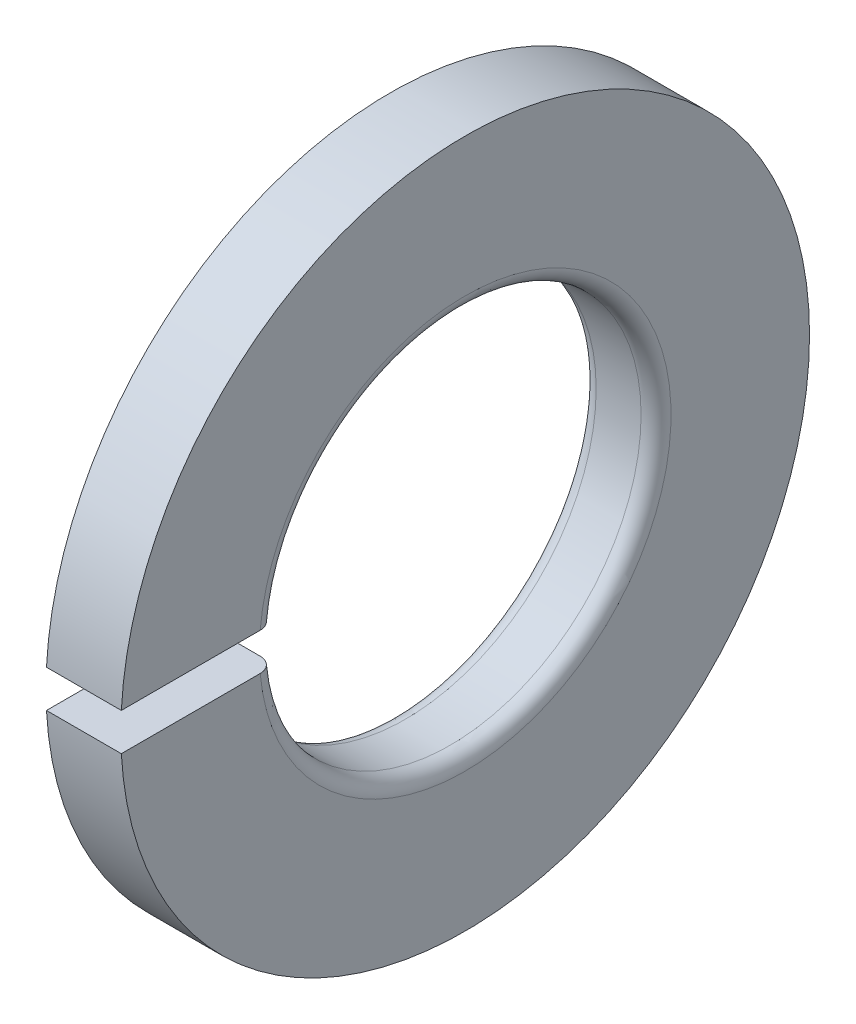
ISO-10303-21;
HEADER;
FILE_DESCRIPTION(('STEP AP214'),'2;1');
FILE_NAME('part.step','',(''),(''),'','','');
FILE_SCHEMA(('AUTOMOTIVE_DESIGN { 1 0 10303 214 1 1 1 1 }'));
ENDSEC;
DATA;
#1=APPLICATION_CONTEXT('core data for automotive mechanical design processes');
#2=APPLICATION_PROTOCOL_DEFINITION('international standard','automotive_design',2000,#1);
#3=PRODUCT_CONTEXT('',#1,'mechanical');
#4=PRODUCT('Part','Part','',(#3));
#5=PRODUCT_RELATED_PRODUCT_CATEGORY('part','',(#4));
#6=PRODUCT_DEFINITION_FORMATION('','',#4);
#7=PRODUCT_DEFINITION_CONTEXT('part definition',#1,'design');
#8=PRODUCT_DEFINITION('design','',#6,#7);
#9=PRODUCT_DEFINITION_SHAPE('','',#8);
#10=(LENGTH_UNIT() NAMED_UNIT(*) SI_UNIT(.MILLI.,.METRE.));
#11=(NAMED_UNIT(*) PLANE_ANGLE_UNIT() SI_UNIT($,.RADIAN.));
#12=(NAMED_UNIT(*) SI_UNIT($,.STERADIAN.) SOLID_ANGLE_UNIT());
#13=UNCERTAINTY_MEASURE_WITH_UNIT(LENGTH_MEASURE(1.E-05),#10,'distance_accuracy_value','');
#14=(GEOMETRIC_REPRESENTATION_CONTEXT(3) GLOBAL_UNCERTAINTY_ASSIGNED_CONTEXT((#13)) GLOBAL_UNIT_ASSIGNED_CONTEXT((#10,
#11,#12)) REPRESENTATION_CONTEXT('',''));
#15=CARTESIAN_POINT('',(0.,0.,0.));
#16=DIRECTION('',(0.,0.,1.));
#17=DIRECTION('',(1.,0.,0.));
#18=AXIS2_PLACEMENT_3D('',#15,#16,#17);
#19=CARTESIAN_POINT('',(-1.,0.25,4.692));
#20=DIRECTION('',(0.,-1.,0.));
#21=DIRECTION('',(0.,0.,-1.));
#22=AXIS2_PLACEMENT_3D('',#19,#20,#21);
#23=PLANE('',#22);
#24=DIRECTION('',(-1.,0.,0.));
#25=VECTOR('',#24,1.);
#26=CARTESIAN_POINT('',(-34.925,0.25,4.59320149786617));
#27=LINE('',#26,#25);
#28=CARTESIAN_POINT('',(0.,0.25,4.59320149786617));
#29=VERTEX_POINT('',#28);
#30=CARTESIAN_POINT('',(-1.,0.25,4.59320149786617));
#31=VERTEX_POINT('',#30);
#32=EDGE_CURVE('E90',#29,#31,#27,.T.);
#33=ORIENTED_EDGE('',*,*,#32,.T.);
#34=DIRECTION('',(0.,0.,-1.));
#35=VECTOR('',#34,1.);
#36=CARTESIAN_POINT('',(-1.,0.25,0.));
#37=LINE('',#36,#35);
#38=CARTESIAN_POINT('',(-1.,0.25,2.73861278752584));
#39=VERTEX_POINT('',#38);
#40=EDGE_CURVE('E25',#31,#39,#37,.T.);
#41=ORIENTED_EDGE('',*,*,#40,.T.);
#42=CARTESIAN_POINT('',(-0.8,0.250000000005694,2.53771550808934));
#43=CARTESIAN_POINT('',(-0.803035810670729,0.249999987980169,2.53771545480922));
#44=CARTESIAN_POINT('',(-0.806071617289434,0.249999353268846,2.53778502517934));
#45=CARTESIAN_POINT('',(-0.812169561448462,0.249997224544185,2.53806448341966));
#46=CARTESIAN_POINT('',(-0.815231630120146,0.24999572134285,2.53827587557851));
#47=CARTESIAN_POINT('',(-0.821375370177262,0.249992240646023,2.53884306055086));
#48=CARTESIAN_POINT('',(-0.824456901392927,0.24999025825402,2.53920037224474));
#49=CARTESIAN_POINT('',(-0.830632451970394,0.249986142296851,2.54006311081197));
#50=CARTESIAN_POINT('',(-0.833726257769468,0.249984007352617,2.54057006675046));
#51=CARTESIAN_POINT('',(-0.839918856411741,0.249979866566684,2.54173550881952));
#52=CARTESIAN_POINT('',(-0.843017360287606,0.249977862316633,2.54239553068693));
#53=CARTESIAN_POINT('',(-0.849211478652672,0.249974210469692,2.54387016019201));
#54=CARTESIAN_POINT('',(-0.852306726952139,0.249972566804721,2.54468630623633));
#55=CARTESIAN_POINT('',(-0.858486093564619,0.24996980900224,2.54647585485791));
#56=CARTESIAN_POINT('',(-0.861569766831158,0.249968700508514,2.54745079439959));
#57=CARTESIAN_POINT('',(-0.867717392994855,0.249967127323592,2.54956018077875));
#58=CARTESIAN_POINT('',(-0.870780820561482,0.249966669341549,2.5506961588209));
#59=CARTESIAN_POINT('',(-0.876879031962958,0.24996644931782,2.55312942023181));
#60=CARTESIAN_POINT('',(-0.879913208977014,0.249966694390875,2.55442822455628));
#61=CARTESIAN_POINT('',(-0.885943682712035,0.24996786814018,2.5571884505233));
#62=CARTESIAN_POINT('',(-0.888939290155829,0.249968803676438,2.55865137821314));
#63=CARTESIAN_POINT('',(-0.894883096912994,0.24997127484204,2.56174064372203));
#64=CARTESIAN_POINT('',(-0.897830523776479,0.249972816372301,2.56336846785874));
#65=CARTESIAN_POINT('',(-0.90366817768213,0.249976355711657,2.56678776820167));
#66=CARTESIAN_POINT('',(-0.906557548677659,0.249978357890109,2.56858070603345));
#67=CARTESIAN_POINT('',(-0.912269055932855,0.249982559741956,2.57232988987556));
#68=CARTESIAN_POINT('',(-0.91509025233708,0.249984761162929,2.5742875676885));
#69=CARTESIAN_POINT('',(-0.920655192954166,0.249989182512798,2.57836528272047));
#70=CARTESIAN_POINT('',(-0.923397913883238,0.249991402412886,2.58048671678096));
#71=CARTESIAN_POINT('',(-0.928795427117442,0.249995013040852,2.58489031594206));
#72=CARTESIAN_POINT('',(-0.931449112331707,0.249996395540874,2.58717383723793));
#73=CARTESIAN_POINT('',(-0.93665827623327,0.249999639817465,2.59189944476943));
#74=CARTESIAN_POINT('',(-0.939212568039209,0.250001506066267,2.59434284242153));
#75=CARTESIAN_POINT('',(-0.942865737354382,0.249999294268007,2.59802761001335));
#76=CARTESIAN_POINT('',(-0.944016716963839,0.249997848045343,2.59921774641522));
#77=CARTESIAN_POINT('',(-0.946436955598768,0.249992015378647,2.60178337342184));
#78=CARTESIAN_POINT('',(-0.947702060456812,0.249987270031931,2.60316279257131));
#79=CARTESIAN_POINT('',(-0.950336883265941,0.249976328201997,2.60611768888772));
#80=CARTESIAN_POINT('',(-0.951701827284564,0.249970027454677,2.60769742206626));
#81=CARTESIAN_POINT('',(-0.954520440133283,0.249956495603357,2.61106430366604));
#82=CARTESIAN_POINT('',(-0.955968677887271,0.249949235688106,2.61285600171163));
#83=CARTESIAN_POINT('',(-0.958935598091309,0.249934652611646,2.61665841612671));
#84=CARTESIAN_POINT('',(-0.960448152929154,0.249927387349311,2.61867391628605));
#85=CARTESIAN_POINT('',(-0.963522883097121,0.249913529254065,2.62293550437869));
#86=CARTESIAN_POINT('',(-0.965078195271772,0.249907047469174,2.62518654719765));
#87=CARTESIAN_POINT('',(-0.96821492990264,0.249895454603422,2.6299303770685));
#88=CARTESIAN_POINT('',(-0.969788715713551,0.24989049218089,2.63242821696515));
#89=CARTESIAN_POINT('',(-0.972936080907932,0.249882511425128,2.63767596624588));
#90=CARTESIAN_POINT('',(-0.974501214454978,0.249879661965969,2.64043094407411));
#91=CARTESIAN_POINT('',(-0.977602073424938,0.249876321101981,2.64620202173346));
#92=CARTESIAN_POINT('',(-0.979128512464887,0.249876003780574,2.6492231155797));
#93=CARTESIAN_POINT('',(-0.982119821171879,0.249877927152562,2.6555335844975));
#94=CARTESIAN_POINT('',(-0.983574535763805,0.249880332477473,2.65882777247265));
#95=CARTESIAN_POINT('',(-0.986387421543504,0.24988763723449,2.66568956550157));
#96=CARTESIAN_POINT('',(-0.987734556350957,0.249892677709196,2.66926171344294));
#97=CARTESIAN_POINT('',(-0.989627808974364,0.249901691559462,2.67474915221755));
#98=CARTESIAN_POINT('',(-0.99024866941524,0.24990502068665,2.67663899777296));
#99=CARTESIAN_POINT('',(-0.991450293532205,0.249912131587267,2.68048789037089));
#100=CARTESIAN_POINT('',(-0.992029509533326,0.249915923201213,2.68244742255276));
#101=CARTESIAN_POINT('',(-0.993142608549284,0.24992384847362,2.68643523544467));
#102=CARTESIAN_POINT('',(-0.993674887139822,0.249927988526809,2.68846396359265));
#103=CARTESIAN_POINT('',(-0.994688765771522,0.249936472335185,2.69258953922476));
#104=CARTESIAN_POINT('',(-0.995168706198018,0.249940818590375,2.69468679481209));
#105=CARTESIAN_POINT('',(-0.996072412565941,0.24994954749752,2.69894847424996));
#106=CARTESIAN_POINT('',(-0.996494464073643,0.249953928320121,2.70111326173971));
#107=CARTESIAN_POINT('',(-0.997276773986528,0.249962528297684,2.70550874460131));
#108=CARTESIAN_POINT('',(-0.997635264152406,0.249966740857766,2.70773975482897));
#109=CARTESIAN_POINT('',(-0.998284720346989,0.249974773915035,2.71226608185326));
#110=CARTESIAN_POINT('',(-0.998573865492926,0.24997858261966,2.71456166005853));
#111=CARTESIAN_POINT('',(-0.999078809068745,0.249985543678804,2.71921516144835));
#112=CARTESIAN_POINT('',(-0.999292735513834,0.24998867861472,2.7215732879133));
#113=CARTESIAN_POINT('',(-0.999641336355726,0.249993992529703,2.72634954184166));
#114=CARTESIAN_POINT('',(-0.999774089267445,0.249996148042166,2.72876780969756));
#115=CARTESIAN_POINT('',(-0.999954416105083,0.249999166715088,2.73366159768258));
#116=CARTESIAN_POINT('',(-1.00000002187016,0.249999999943751,2.73613719048148));
#117=CARTESIAN_POINT('',(-1.,0.25,2.73861278752583));
#118=B_SPLINE_CURVE_WITH_KNOTS('',3,(#42,#43,#44,#45,#46,#47,#48,#49,#50,#51,#52,#53,#54,#55,
#56,#57,#58,#59,#60,#61,#62,#63,#64,#65,#66,#67,#68,#69,#70,#71,#72,#73,#74,#75,#76,#77,#78,#79,
#80,#81,#82,#83,#84,#85,#86,#87,#88,#89,#90,#91,#92,#93,#94,#95,#96,#97,#98,#99,#100,#101,#102,
#103,#104,#105,#106,#107,#108,#109,#110,#111,#112,#113,#114,#115,#116,#117),.UNSPECIFIED.,.F.,
.F.,(4,2,2,2,2,2,2,2,2,2,2,2,2,2,2,2,2,2,2,2,2,2,2,2,2,2,2,2,2,2,2,2,2,2,2,2,2,4),(0.,
0.0091066334769609,0.0183114201061973,0.0276145660572049,0.0370162718552952,0.0465167330499193,
0.0561161408662146,0.0658146828384725,0.0756125434240239,0.0855099045958595,0.0955069464120868,
0.105603847560138,0.115800785873432,0.126097938817996,0.13649548394635,0.146993599315768,
0.15759246386785,0.162559016778658,0.168173381856494,0.174435605098134,0.181345725168376,
0.188903777233304,0.197109795425888,0.205963814531432,0.215465871190603,0.225616004774338,
0.236414258008793,0.247860677385231,0.253827618592855,0.259956675222,0.266247857164978,
0.272701174626643,0.279316638110895,0.286094258402887,0.293034046546651,0.300136013817895,
0.307400171691676,0.314826531804691),.UNSPECIFIED.);
#119=CARTESIAN_POINT('',(-0.799999999990839,0.25,2.53771550803154));
#120=VERTEX_POINT('',#119);
#121=EDGE_CURVE('E160',#120,#39,#118,.T.);
#122=ORIENTED_EDGE('',*,*,#121,.F.);
#123=DIRECTION('',(1.,0.,0.));
#124=VECTOR('',#123,1.);
#125=CARTESIAN_POINT('',(-34.925,0.25,2.53771550808991));
#126=LINE('',#125,#124);
#127=CARTESIAN_POINT('',(-0.2,0.25,2.53771550808991));
#128=VERTEX_POINT('',#127);
#129=EDGE_CURVE('E164',#120,#128,#126,.T.);
#130=ORIENTED_EDGE('',*,*,#129,.T.);
#131=CARTESIAN_POINT('',(0.,0.25,2.73861278752583));
#132=CARTESIAN_POINT('',(2.18630139981742E-08,0.249999999943789,2.73613739701448));
#133=CARTESIAN_POINT('',(-4.55762893479276E-05,0.24999916671474,2.73366201074611));
#134=CARTESIAN_POINT('',(-0.000225873773357249,0.249996147951057,2.72876861076899));
#135=CARTESIAN_POINT('',(-0.000358605982107729,0.249993992339121,2.72635052443488));
#136=CARTESIAN_POINT('',(-0.000707154429438264,0.24998867804353,2.72157460794371));
#137=CARTESIAN_POINT('',(-0.000921050179730413,0.249985542821434,2.7192166374782));
#138=CARTESIAN_POINT('',(-0.00142592442332328,0.249978580939847,2.71456342216856));
#139=CARTESIAN_POINT('',(-0.00171503188571923,0.249974771697552,2.71226797416306));
#140=CARTESIAN_POINT('',(-0.00236440769589465,0.249966737267937,2.70774188152525));
#141=CARTESIAN_POINT('',(-0.00272285607107772,0.249962523874993,2.70551097563379));
#142=CARTESIAN_POINT('',(-0.00350508018199406,0.249953921907547,2.70111567553281));
#143=CARTESIAN_POINT('',(-0.00392708854420214,0.249949539932554,2.69895096664308));
#144=CARTESIAN_POINT('',(-0.00483070905884299,0.249940808387292,2.69468941876843));
#145=CARTESIAN_POINT('',(-0.00531060759859625,0.249936460653408,2.69259221634177));
#146=CARTESIAN_POINT('',(-0.00632440540788457,0.249927973561392,2.6884667218211));
#147=CARTESIAN_POINT('',(-0.00685664583891303,0.24992383171228,2.68643802183925));
#148=CARTESIAN_POINT('',(-0.00796967384973133,0.249915902543141,2.68245024062773));
#149=CARTESIAN_POINT('',(-0.00854885773674891,0.249912108839002,2.68049071218918));
#150=CARTESIAN_POINT('',(-0.00975042514975218,0.249904993487638,2.67664180309654));
#151=CARTESIAN_POINT('',(-0.0103712616874673,0.249901662011683,2.67475193754321));
#152=CARTESIAN_POINT('',(-0.0122644699242043,0.249892640819421,2.66926436999144));
#153=CARTESIAN_POINT('',(-0.0136115894664298,0.249887595042854,2.66569211383123));
#154=CARTESIAN_POINT('',(-0.0164244952831761,0.249880279185803,2.65883001732693));
#155=CARTESIAN_POINT('',(-0.0178792496325221,0.249877868166916,2.65553563609904));
#156=CARTESIAN_POINT('',(-0.020870700906079,0.249875933476025,2.64922470116607));
#157=CARTESIAN_POINT('',(-0.0223972465542912,0.249876245267126,2.6462033364856));
#158=CARTESIAN_POINT('',(-0.0254983919397497,0.249879575760511,2.64043164537649));
#159=CARTESIAN_POINT('',(-0.0270637084673507,0.249882420451496,2.63767632671061));
#160=CARTESIAN_POINT('',(-0.0302115207831002,0.249890393000787,2.63242783145036));
#161=CARTESIAN_POINT('',(-0.0317855733193617,0.249895352020401,2.62992958796494));
#162=CARTESIAN_POINT('',(-0.0349229285126084,0.249906940018394,2.62518489349163));
#163=CARTESIAN_POINT('',(-0.0364785965569638,0.24991342032215,2.62293339092663));
#164=CARTESIAN_POINT('',(-0.0395541297062014,0.249927277991779,2.61867083189355));
#165=CARTESIAN_POINT('',(-0.041067133172976,0.249934544218703,2.6166548214713));
#166=CARTESIAN_POINT('',(-0.0440350443824434,0.249949132164708,2.61285133992501));
#167=CARTESIAN_POINT('',(-0.0454838255487885,0.249956395805724,2.61105908556477));
#168=CARTESIAN_POINT('',(-0.0483036200083203,0.249969938768157,2.60769104822344));
#169=CARTESIAN_POINT('',(-0.0496692028122824,0.249976246552687,2.60611071576471));
#170=CARTESIAN_POINT('',(-0.0523053977858411,0.249987205511879,2.60315457985704));
#171=CARTESIAN_POINT('',(-0.0535712361826897,0.24999196052777,2.60177452010478));
#172=CARTESIAN_POINT('',(-0.0559930349613682,0.2499978186797,2.59920757119292));
#173=CARTESIAN_POINT('',(-0.0571448409500505,0.249999279595896,2.59801675277638));
#174=CARTESIAN_POINT('',(-0.0607984174761133,0.250001535995203,2.59433216638235));
#175=CARTESIAN_POINT('',(-0.0633522325210134,0.249999705638478,2.59188958391966));
#176=CARTESIAN_POINT('',(-0.0685604245889835,0.249996520807756,2.58716549180807));
#177=CARTESIAN_POINT('',(-0.0712136177826744,0.249995161983957,2.58488267394276));
#178=CARTESIAN_POINT('',(-0.0766101419244031,0.249991593131311,2.58048037144688));
#179=CARTESIAN_POINT('',(-0.0793523686080947,0.249989391364562,2.57835953393239));
#180=CARTESIAN_POINT('',(-0.0849163286929747,0.249984999438434,2.57428290767685));
#181=CARTESIAN_POINT('',(-0.0877370413985438,0.249982809371634,2.57232572550125));
#182=CARTESIAN_POINT('',(-0.0934476010108547,0.249978624373543,2.5685774355022));
#183=CARTESIAN_POINT('',(-0.0963365104170268,0.249976627753656,2.56678489936016));
#184=CARTESIAN_POINT('',(-0.10217327166956,0.249973094210416,2.56336631272516));
#185=CARTESIAN_POINT('',(-0.105120269592651,0.249971552978027,2.56173880415095));
#186=CARTESIAN_POINT('',(-0.111063258645877,0.249969077859808,2.55865008860764));
#187=CARTESIAN_POINT('',(-0.114058479222035,0.249968138130129,2.55718739890921));
#188=CARTESIAN_POINT('',(-0.120088227923821,0.249966952259826,2.55442757690813));
#189=CARTESIAN_POINT('',(-0.123122068445446,0.249966699311301,2.55312894217513));
#190=CARTESIAN_POINT('',(-0.129219662948015,0.24996690074148,2.55069595758472));
#191=CARTESIAN_POINT('',(-0.132282811564275,0.249967348050167,2.54956009040257));
#192=CARTESIAN_POINT('',(-0.138429942156175,0.249968897989504,2.54745087343286));
#193=CARTESIAN_POINT('',(-0.141513400046784,0.249969993946169,2.54647599607195));
#194=CARTESIAN_POINT('',(-0.147692403346863,0.249972725762577,2.54468652984083));
#195=CARTESIAN_POINT('',(-0.15078750475191,0.249974356001969,2.54387040762508));
#196=CARTESIAN_POINT('',(-0.156981400763264,0.249977981103339,2.54239579432859));
#197=CARTESIAN_POINT('',(-0.160079830026201,0.249979972042991,2.54173576843576));
#198=CARTESIAN_POINT('',(-0.166272353783865,0.249984087349718,2.5405702974742));
#199=CARTESIAN_POINT('',(-0.169366159970223,0.249986210118863,2.54006332022797));
#200=CARTESIAN_POINT('',(-0.175541787513029,0.249990303913966,2.53920052880077));
#201=CARTESIAN_POINT('',(-0.178623395787023,0.249992276294791,2.53884318906861));
#202=CARTESIAN_POINT('',(-0.184767366981952,0.24999574019279,2.53827594828228));
#203=CARTESIAN_POINT('',(-0.187829590043833,0.24999723656265,2.53806453180766));
#204=CARTESIAN_POINT('',(-0.193927919865005,0.249999355902649,2.53778503550966));
#205=CARTESIAN_POINT('',(-0.196963957905985,0.249999987994693,2.53771545479351));
#206=CARTESIAN_POINT('',(-0.2,0.25,2.5377155080899));
#207=B_SPLINE_CURVE_WITH_KNOTS('',3,(#131,#132,#133,#134,#135,#136,#137,#138,#139,#140,#141,
#142,#143,#144,#145,#146,#147,#148,#149,#150,#151,#152,#153,#154,#155,#156,#157,#158,#159,#160,
#161,#162,#163,#164,#165,#166,#167,#168,#169,#170,#171,#172,#173,#174,#175,#176,#177,#178,#179,
#180,#181,#182,#183,#184,#185,#186,#187,#188,#189,#190,#191,#192,#193,#194,#195,#196,#197,#198,
#199,#200,#201,#202,#203,#204,#205,#206),.UNSPECIFIED.,.F.,.F.,(4,2,2,2,2,2,2,2,2,2,2,2,2,2,2,2,
2,2,2,2,2,2,2,2,2,2,2,2,2,2,2,2,2,2,2,2,2,4),(0.,0.0074257406256499,0.0146893517035632,
0.0217908448666269,0.0287302315862876,0.0355075231348463,0.0421227305531616,0.0485758646234472,
0.0548669358469176,0.0609959544259886,0.0669629302507866,0.0784096367681095,0.0892084677236841,
0.0993594696175504,0.108862685186243,0.11771815381215,0.125925912147751,0.133485994989542,
0.140398436479562,0.146663271788391,0.152280539576362,0.157250285818283,0.167846430876044,
0.178342054113755,0.188737334533879,0.199032450249775,0.209227578864632,0.219322897889018,
0.229318585193989,0.239214819496867,0.249011780876988,0.258709651318936,0.268308615280953,
0.277808860286439,0.287210577536652,0.296513962542896,0.305719215776723,0.314826543336796),.UNSPECIFIED.);
#208=CARTESIAN_POINT('',(0.,0.25,2.73861278752583));
#209=VERTEX_POINT('',#208);
#210=EDGE_CURVE('E92',#209,#128,#207,.T.);
#211=ORIENTED_EDGE('',*,*,#210,.F.);
#212=DIRECTION('',(0.,0.,-1.));
#213=VECTOR('',#212,1.);
#214=CARTESIAN_POINT('',(0.,0.25,4.692));
#215=LINE('',#214,#213);
#216=EDGE_CURVE('E87',#29,#209,#215,.T.);
#217=ORIENTED_EDGE('',*,*,#216,.F.);
#218=EDGE_LOOP('',(#33,#41,#122,#130,#211,#217));
#219=FACE_BOUND('',#218,.T.);
#220=ADVANCED_FACE('F15',(#219),#23,.T.);
#221=CARTESIAN_POINT('',(-1.,-0.25,0.));
#222=DIRECTION('',(0.,1.,0.));
#223=DIRECTION('',(1.,0.,0.));
#224=AXIS2_PLACEMENT_3D('',#221,#222,#223);
#225=PLANE('',#224);
#226=DIRECTION('',(1.,0.,0.));
#227=VECTOR('',#226,1.);
#228=CARTESIAN_POINT('',(-34.925,-0.25,4.59320149786617));
#229=LINE('',#228,#227);
#230=CARTESIAN_POINT('',(-1.,-0.25,4.59320149786617));
#231=VERTEX_POINT('',#230);
#232=CARTESIAN_POINT('',(0.,-0.25,4.59320149786617));
#233=VERTEX_POINT('',#232);
#234=EDGE_CURVE('E109',#231,#233,#229,.T.);
#235=ORIENTED_EDGE('',*,*,#234,.T.);
#236=DIRECTION('',(0.,0.,1.));
#237=VECTOR('',#236,1.);
#238=CARTESIAN_POINT('',(0.,-0.25,0.));
#239=LINE('',#238,#237);
#240=CARTESIAN_POINT('',(0.,-0.25,2.73861278752583));
#241=VERTEX_POINT('',#240);
#242=EDGE_CURVE('E104',#241,#233,#239,.T.);
#243=ORIENTED_EDGE('',*,*,#242,.F.);
#244=CARTESIAN_POINT('',(-0.2,-0.249999999999992,2.5377155080899));
#245=CARTESIAN_POINT('',(-0.196964189324893,-0.249999987974466,2.53771545480978));
#246=CARTESIAN_POINT('',(-0.193928382701809,-0.24999935326317,2.5377850251801));
#247=CARTESIAN_POINT('',(-0.187830438534622,-0.249997224538614,2.53806448342118));
#248=CARTESIAN_POINT('',(-0.184768369859155,-0.249995721337355,2.53827587558058));
#249=CARTESIAN_POINT('',(-0.178624629795092,-0.249992240640719,2.53884306055432));
#250=CARTESIAN_POINT('',(-0.175543098576261,-0.249990258248832,2.53920037224901));
#251=CARTESIAN_POINT('',(-0.169367547993091,-0.249986142291928,2.5400631108181));
#252=CARTESIAN_POINT('',(-0.166273742191478,-0.249984007347846,2.5405700667576));
#253=CARTESIAN_POINT('',(-0.160081143544766,-0.249979866562237,2.54173550882883));
#254=CARTESIAN_POINT('',(-0.156982639666997,-0.249977862312358,2.54239553069736));
#255=CARTESIAN_POINT('',(-0.150788521298759,-0.249974210465781,2.54387016020475));
#256=CARTESIAN_POINT('',(-0.14769327299802,-0.249972566801004,2.54468630625024));
#257=CARTESIAN_POINT('',(-0.141513906383625,-0.249969808998914,2.54647585487413));
#258=CARTESIAN_POINT('',(-0.138430233116437,-0.249968700505386,2.54745079441691));
#259=CARTESIAN_POINT('',(-0.132282606952056,-0.249967127320866,2.54956018079821));
#260=CARTESIAN_POINT('',(-0.129219179385385,-0.249966669339025,2.55069615884133));
#261=CARTESIAN_POINT('',(-0.123120967984412,-0.249966449315691,2.55312942025404));
#262=CARTESIAN_POINT('',(-0.120086790970892,-0.24996669438894,2.55442822457929));
#263=CARTESIAN_POINT('',(-0.114056317237501,-0.249967868138619,2.55718845054759));
#264=CARTESIAN_POINT('',(-0.111060709794788,-0.249968803675057,2.55865137823792));
#265=CARTESIAN_POINT('',(-0.105116903040304,-0.249971274840999,2.56174064374744));
#266=CARTESIAN_POINT('',(-0.102169476178404,-0.24997281637142,2.56336846788427));
#267=CARTESIAN_POINT('',(-0.0963318222763901,-0.249976355711063,2.56678776822702));
#268=CARTESIAN_POINT('',(-0.0934424512828973,-0.249978357889643,2.56858070605848));
#269=CARTESIAN_POINT('',(-0.0877309440321833,-0.249982559741716,2.57232988989945));
#270=CARTESIAN_POINT('',(-0.0849097476303873,-0.249984761162786,2.57428756771156));
#271=CARTESIAN_POINT('',(-0.0793448070185001,-0.249989182512804,2.5783652827413));
#272=CARTESIAN_POINT('',(-0.0766020860921807,-0.249991402412944,2.58048671680038));
#273=CARTESIAN_POINT('',(-0.0712045728637473,-0.249995013040974,2.58489031595803));
#274=CARTESIAN_POINT('',(-0.0685508876524812,-0.24999639554101,2.58717383725185));
#275=CARTESIAN_POINT('',(-0.0633417237571016,-0.24999963981756,2.59189944477857));
#276=CARTESIAN_POINT('',(-0.0607874319543256,-0.250001506066305,2.59434284242792));
#277=CARTESIAN_POINT('',(-0.057134262641161,-0.249999294267968,2.59802761001791));
#278=CARTESIAN_POINT('',(-0.055983283030733,-0.249997848045275,2.59921774642087));
#279=CARTESIAN_POINT('',(-0.0535630443940644,-0.249992015378536,2.60178337342958));
#280=CARTESIAN_POINT('',(-0.0522979395352509,-0.249987270031805,2.60316279258004));
#281=CARTESIAN_POINT('',(-0.0496631167247878,-0.249976328201846,2.60611768889833));
#282=CARTESIAN_POINT('',(-0.0482981727055976,-0.249970027454516,2.60769742207776));
#283=CARTESIAN_POINT('',(-0.0454795598559445,-0.249956495603183,2.61106430367921));
#284=CARTESIAN_POINT('',(-0.0440313221015863,-0.249949235687929,2.61285600172557));
#285=CARTESIAN_POINT('',(-0.0410644018970027,-0.249934652611471,2.61665841614208));
#286=CARTESIAN_POINT('',(-0.0395518470589777,-0.249927387349141,2.61867391630207));
#287=CARTESIAN_POINT('',(-0.0364771168908344,-0.249913529253905,2.62293550439588));
#288=CARTESIAN_POINT('',(-0.0349218047161818,-0.24990704746902,2.62518654721534));
#289=CARTESIAN_POINT('',(-0.0317850700854806,-0.249895454603284,2.62993037708706));
#290=CARTESIAN_POINT('',(-0.030211284274732,-0.249890492180761,2.63242821698406));
#291=CARTESIAN_POINT('',(-0.0270639190808263,-0.24988251142502,2.63767596626532));
#292=CARTESIAN_POINT('',(-0.0254987855340859,-0.249879661965872,2.64043094409373));
#293=CARTESIAN_POINT('',(-0.0223979265648659,-0.249876321101906,2.64620202175324));
#294=CARTESIAN_POINT('',(-0.0208714875253425,-0.249876003780509,2.64922311559946));
#295=CARTESIAN_POINT('',(-0.0178801788192994,-0.249877927152519,2.65553358451702));
#296=CARTESIAN_POINT('',(-0.0164254642278877,-0.249880332477442,2.65882777249195));
#297=CARTESIAN_POINT('',(-0.013612578449283,-0.249887637234477,2.66568956552019));
#298=CARTESIAN_POINT('',(-0.0122654436423985,-0.249892677709188,2.66926171346111));
#299=CARTESIAN_POINT('',(-0.0103721910198325,-0.249901691559465,2.67474915223494));
#300=CARTESIAN_POINT('',(-0.0097513305792477,-0.249905020686658,2.67663899779004));
#301=CARTESIAN_POINT('',(-0.00854970646286538,-0.249912131587279,2.68048789038728));
#302=CARTESIAN_POINT('',(-0.0079704904620339,-0.249915923201224,2.68244742256877));
#303=CARTESIAN_POINT('',(-0.00685739144664883,-0.249923848473633,2.68643523545988));
#304=CARTESIAN_POINT('',(-0.006325112856392,-0.249927988526823,2.68846396360742));
#305=CARTESIAN_POINT('',(-0.00531123422524181,-0.249936472335202,2.69258953923859));
#306=CARTESIAN_POINT('',(-0.00483129379901255,-0.249940818590393,2.69468679482542));
#307=CARTESIAN_POINT('',(-0.00392758743160403,-0.249949547497537,2.69894847426223));
#308=CARTESIAN_POINT('',(-0.00350553592414775,-0.249953928320137,2.70111326175142));
#309=CARTESIAN_POINT('',(-0.00272322601172843,-0.249962528297701,2.70550874461183));
#310=CARTESIAN_POINT('',(-0.00236473584606731,-0.249966740857785,2.70773975483887));
#311=CARTESIAN_POINT('',(-0.00171527965188707,-0.249974773915051,2.71226608186185));
#312=CARTESIAN_POINT('',(-0.00142613450613195,-0.249978582619671,2.71456166006643));
#313=CARTESIAN_POINT('',(-0.000921190930638207,-0.249985543678813,2.71921516145483));
#314=CARTESIAN_POINT('',(-0.00070726448568893,-0.249988678614729,2.72157328791903));
#315=CARTESIAN_POINT('',(-0.000358663644029337,-0.249993992529712,2.72634954184584));
#316=CARTESIAN_POINT('',(-0.000225910732399715,-0.249996148042173,2.72876780970094));
#317=CARTESIAN_POINT('',(-4.55838948854964E-05,-0.249999166715091,2.7336615976843));
#318=CARTESIAN_POINT('',(2.18701560313154E-08,-0.249999999943752,2.73613719048233));
#319=CARTESIAN_POINT('',(0.,-0.250000000000004,2.73861278752583));
#320=B_SPLINE_CURVE_WITH_KNOTS('',3,(#244,#245,#246,#247,#248,#249,#250,#251,#252,#253,#254,
#255,#256,#257,#258,#259,#260,#261,#262,#263,#264,#265,#266,#267,#268,#269,#270,#271,#272,#273,
#274,#275,#276,#277,#278,#279,#280,#281,#282,#283,#284,#285,#286,#287,#288,#289,#290,#291,#292,
#293,#294,#295,#296,#297,#298,#299,#300,#301,#302,#303,#304,#305,#306,#307,#308,#309,#310,#311,
#312,#313,#314,#315,#316,#317,#318,#319),.UNSPECIFIED.,.F.,.F.,(4,2,2,2,2,2,2,2,2,2,2,2,2,2,2,2,
2,2,2,2,2,2,2,2,2,2,2,2,2,2,2,2,2,2,2,2,2,4),(0.,0.00910663349009214,0.0183114201307491,
0.027614566091466,0.0370162718975539,0.0465167330984638,0.0561161409193331,0.0658146828944527,
0.075612543481154,0.0855099046524277,0.0955069464663812,0.105603847610448,0.115800785918047,
0.126097938855204,0.136495483974442,0.146993599333034,0.157592463872583,0.16255901678777,
0.168173381869359,0.174435605114128,0.181345725186875,0.188903777253683,0.197109795447522,
0.205963814553697,0.215465871212874,0.22561600479599,0.236414258029201,0.247860677403771,
0.253827618610226,0.259956675238046,0.266247857179542,0.272701174639569,0.279316638122028,
0.28609425841207,0.293034046553728,0.300136013822707,0.307400171694069,0.314826531804509),.UNSPECIFIED.);
#321=CARTESIAN_POINT('',(-0.2,-0.25,2.53771550808991));
#322=VERTEX_POINT('',#321);
#323=EDGE_CURVE('E173',#322,#241,#320,.T.);
#324=ORIENTED_EDGE('',*,*,#323,.F.);
#325=DIRECTION('',(-1.,0.,0.));
#326=VECTOR('',#325,1.);
#327=CARTESIAN_POINT('',(-34.925,-0.25,2.53771550808991));
#328=LINE('',#327,#326);
#329=CARTESIAN_POINT('',(-0.8,-0.25,2.53771550808991));
#330=VERTEX_POINT('',#329);
#331=EDGE_CURVE('E257',#322,#330,#328,.T.);
#332=ORIENTED_EDGE('',*,*,#331,.T.);
#333=CARTESIAN_POINT('',(-1.,-0.250000000000004,2.73861278752583));
#334=CARTESIAN_POINT('',(-1.00000002186301,-0.249999999943793,2.73613739701654));
#335=CARTESIAN_POINT('',(-0.999954423710728,-0.249999166714746,2.73366201075023));
#336=CARTESIAN_POINT('',(-0.999774126227016,-0.249996147951067,2.72876861077708));
#337=CARTESIAN_POINT('',(-0.999641394018479,-0.249993992339134,2.7263505244449));
#338=CARTESIAN_POINT('',(-0.999292845571703,-0.249988678043546,2.72157460795742));
#339=CARTESIAN_POINT('',(-0.999078949821744,-0.249985542821449,2.71921663749367));
#340=CARTESIAN_POINT('',(-0.998574075578924,-0.249978580939867,2.71456342218742));
#341=CARTESIAN_POINT('',(-0.998284968116961,-0.249974771697576,2.71226797418355));
#342=CARTESIAN_POINT('',(-0.997635592307739,-0.249966737267965,2.70774188154882));
#343=CARTESIAN_POINT('',(-0.997277143933071,-0.249962523875024,2.70551097565883));
#344=CARTESIAN_POINT('',(-0.996494919823253,-0.249953921907578,2.70111567556061));
#345=CARTESIAN_POINT('',(-0.996072911461624,-0.249949539932583,2.69895096667219));
#346=CARTESIAN_POINT('',(-0.995169290948191,-0.249940808387318,2.6946894188));
#347=CARTESIAN_POINT('',(-0.994689392409062,-0.249936460653432,2.6925922163745));
#348=CARTESIAN_POINT('',(-0.993675594601058,-0.24992797356141,2.68846672185597));
#349=CARTESIAN_POINT('',(-0.993143354170684,-0.249923831712295,2.68643802187512));
#350=CARTESIAN_POINT('',(-0.992030326161194,-0.249915902543147,2.68245024066543));
#351=CARTESIAN_POINT('',(-0.991451142274845,-0.249912108839003,2.68049071222773));
#352=CARTESIAN_POINT('',(-0.990249574863183,-0.249904993487627,2.67664180313661));
#353=CARTESIAN_POINT('',(-0.989628738326136,-0.249901662011665,2.67475193758398));
#354=CARTESIAN_POINT('',(-0.987735530091307,-0.249892640819379,2.66926437003386));
#355=CARTESIAN_POINT('',(-0.986388410550363,-0.249887595042792,2.6656921138746));
#356=CARTESIAN_POINT('',(-0.98357550473605,-0.249880279185694,2.65883001737159));
#357=CARTESIAN_POINT('',(-0.982120750387827,-0.249877868166779,2.65553563614408));
#358=CARTESIAN_POINT('',(-0.979129299116296,-0.249875933475834,2.64922470121133));
#359=CARTESIAN_POINT('',(-0.977602753468962,-0.249876245266909,2.64620333653071));
#360=CARTESIAN_POINT('',(-0.974501608084963,-0.249879575760238,2.64043164542081));
#361=CARTESIAN_POINT('',(-0.972936291557922,-0.249882420451195,2.63767632675431));
#362=CARTESIAN_POINT('',(-0.969788479242933,-0.249890393000435,2.63242783149236));
#363=CARTESIAN_POINT('',(-0.968214426706854,-0.249895352020026,2.62992958800589));
#364=CARTESIAN_POINT('',(-0.96507707151356,-0.249906940017982,2.62518489353006));
#365=CARTESIAN_POINT('',(-0.963521403468961,-0.249913420321722,2.62293339096361));
#366=CARTESIAN_POINT('',(-0.960445870318786,-0.24992727799133,2.61867083192727));
#367=CARTESIAN_POINT('',(-0.958932866851306,-0.249934544218248,2.61665482150323));
#368=CARTESIAN_POINT('',(-0.955964955639947,-0.249949132164256,2.61285133995302));
#369=CARTESIAN_POINT('',(-0.954516174472407,-0.24995639580528,2.61105908559067));
#370=CARTESIAN_POINT('',(-0.951696380009986,-0.249969938767751,2.60769104824484));
#371=CARTESIAN_POINT('',(-0.950330797204324,-0.249976246552309,2.60611071578371));
#372=CARTESIAN_POINT('',(-0.947694602226854,-0.249987205511572,2.60315457987099));
#373=CARTESIAN_POINT('',(-0.94642876382779,-0.249991960527504,2.60177452011608));
#374=CARTESIAN_POINT('',(-0.944006965044166,-0.249997818679551,2.59920757119865));
#375=CARTESIAN_POINT('',(-0.942855159052752,-0.249999279595818,2.59801675277921));
#376=CARTESIAN_POINT('',(-0.939201582525618,-0.250001535995348,2.59433216638408));
#377=CARTESIAN_POINT('',(-0.936647767482543,-0.249999705638803,2.59188958392303));
#378=CARTESIAN_POINT('',(-0.931439575418145,-0.249996520808373,2.5871654918143));
#379=CARTESIAN_POINT('',(-0.92878638222619,-0.249995161984685,2.58488267395023));
#380=CARTESIAN_POINT('',(-0.92338985808781,-0.249991593132237,2.58048037145645));
#381=CARTESIAN_POINT('',(-0.920647631405719,-0.249989391365576,2.57835953394283));
#382=CARTESIAN_POINT('',(-0.91508367132387,-0.249984999439586,2.57428290768867));
#383=CARTESIAN_POINT('',(-0.912262958619721,-0.249982809372836,2.5723257255136));
#384=CARTESIAN_POINT('',(-0.90655239901004,-0.24997862437482,2.56857743551531));
#385=CARTESIAN_POINT('',(-0.903663489605068,-0.249976627754957,2.56678489937351));
#386=CARTESIAN_POINT('',(-0.89782672835469,-0.249973094211739,2.5633663127387));
#387=CARTESIAN_POINT('',(-0.894879730432544,-0.249971552979349,2.56173880416448));
#388=CARTESIAN_POINT('',(-0.888936741380933,-0.249969077861105,2.55865008862089));
#389=CARTESIAN_POINT('',(-0.885941520805437,-0.249968138131403,2.55718739892222));
#390=CARTESIAN_POINT('',(-0.87991177210467,-0.249966952261035,2.55442757692049));
#391=CARTESIAN_POINT('',(-0.876877931583398,-0.249966699312471,2.55312894218708));
#392=CARTESIAN_POINT('',(-0.870780337081209,-0.249966900742557,2.55069595759572));
#393=CARTESIAN_POINT('',(-0.867717188464971,-0.249967348051191,2.54956009041304));
#394=CARTESIAN_POINT('',(-0.861570057872777,-0.249968897990415,2.54745087344218));
#395=CARTESIAN_POINT('',(-0.858486599981845,-0.24996999394702,2.54647599608065));
#396=CARTESIAN_POINT('',(-0.852307596680771,-0.249972725763303,2.54468652984827));
#397=CARTESIAN_POINT('',(-0.849212495275047,-0.249974356002631,2.54387040763187));
#398=CARTESIAN_POINT('',(-0.843018599261981,-0.249977981103877,2.5423957943341));
#399=CARTESIAN_POINT('',(-0.839920169998005,-0.249979972043469,2.54173576844065));
#400=CARTESIAN_POINT('',(-0.833727646237906,-0.249984087350076,2.54057029747789));
#401=CARTESIAN_POINT('',(-0.830633840050148,-0.249986210119163,2.54006332023109));
#402=CARTESIAN_POINT('',(-0.824458212504184,-0.249990303914164,2.53920052880285));
#403=CARTESIAN_POINT('',(-0.82137660422843,-0.249992276294945,2.53884318907024));
#404=CARTESIAN_POINT('',(-0.815232633029631,-0.249995740192868,2.53827594828313));
#405=CARTESIAN_POINT('',(-0.812170409965638,-0.249997236562695,2.5380645318082));
#406=CARTESIAN_POINT('',(-0.806072080139902,-0.24999935590265,2.53778503550978));
#407=CARTESIAN_POINT('',(-0.803036042096468,-0.249999987994682,2.53771545479351));
#408=CARTESIAN_POINT('',(-0.8,-0.249999999999992,2.5377155080899));
#409=B_SPLINE_CURVE_WITH_KNOTS('',3,(#333,#334,#335,#336,#337,#338,#339,#340,#341,#342,#343,
#344,#345,#346,#347,#348,#349,#350,#351,#352,#353,#354,#355,#356,#357,#358,#359,#360,#361,#362,
#363,#364,#365,#366,#367,#368,#369,#370,#371,#372,#373,#374,#375,#376,#377,#378,#379,#380,#381,
#382,#383,#384,#385,#386,#387,#388,#389,#390,#391,#392,#393,#394,#395,#396,#397,#398,#399,#400,
#401,#402,#403,#404,#405,#406,#407,#408),.UNSPECIFIED.,.F.,.F.,(4,2,2,2,2,2,2,2,2,2,2,2,2,2,2,2,
2,2,2,2,2,2,2,2,2,2,2,2,2,2,2,2,2,2,2,2,2,4),(0.,0.00742574061947288,0.0146893516916072,
0.021790844849292,0.0287302315639711,0.0355075231079477,0.0421227305220785,0.0485758645885795,
0.0548669358086632,0.060995954384746,0.0669629302069547,0.0784096367202954,0.0892084676734808,
0.0993594695665518,0.108862685136042,0.117718153764339,0.125925912103925,0.133485994951294,
0.140398436448485,0.146663271766079,0.152280539564407,0.157250285818279,0.167846430868698,
0.178342054100045,0.188737334514783,0.199032450226272,0.2092275788377,0.219322897859636,
0.229318585163137,0.239214819465524,0.249011780846136,0.258709651289555,0.268308615254024,
0.277808860262943,0.28721057751757,0.29651396252921,0.305719215769413,0.314826543336845),.UNSPECIFIED.);
#410=CARTESIAN_POINT('',(-1.,-0.25,2.73861278752584));
#411=VERTEX_POINT('',#410);
#412=EDGE_CURVE('E127',#411,#330,#409,.T.);
#413=ORIENTED_EDGE('',*,*,#412,.F.);
#414=DIRECTION('',(0.,0.,1.));
#415=VECTOR('',#414,1.);
#416=CARTESIAN_POINT('',(-1.,-0.25,0.));
#417=LINE('',#416,#415);
#418=EDGE_CURVE('E9',#411,#231,#417,.T.);
#419=ORIENTED_EDGE('',*,*,#418,.T.);
#420=EDGE_LOOP('',(#235,#243,#324,#332,#413,#419));
#421=FACE_BOUND('',#420,.T.);
#422=ADVANCED_FACE('F199',(#421),#225,.T.);
#423=CARTESIAN_POINT('',(-1.,4.6,0.));
#424=DIRECTION('',(1.,0.,0.));
#425=DIRECTION('',(0.,1.,0.));
#426=AXIS2_PLACEMENT_3D('',#423,#424,#425);
#427=PLANE('',#426);
#428=ORIENTED_EDGE('',*,*,#40,.F.);
#429=CARTESIAN_POINT('',(-1.,0.,0.));
#430=DIRECTION('',(-1.,0.,0.));
#431=DIRECTION('',(0.,0.,1.));
#432=AXIS2_PLACEMENT_3D('',#429,#430,#431);
#433=CIRCLE('',#432,4.6);
#434=EDGE_CURVE('E99',#31,#231,#433,.T.);
#435=ORIENTED_EDGE('',*,*,#434,.T.);
#436=ORIENTED_EDGE('',*,*,#418,.F.);
#437=CARTESIAN_POINT('',(-1.,0.,0.));
#438=DIRECTION('',(-1.,0.,0.));
#439=DIRECTION('',(0.,0.,1.));
#440=AXIS2_PLACEMENT_3D('',#437,#438,#439);
#441=CIRCLE('',#440,2.75);
#442=EDGE_CURVE('E256',#39,#411,#441,.T.);
#443=ORIENTED_EDGE('',*,*,#442,.F.);
#444=EDGE_LOOP('',(#428,#435,#436,#443));
#445=FACE_BOUND('',#444,.T.);
#446=ADVANCED_FACE('F144',(#445),#427,.F.);
#447=CARTESIAN_POINT('',(-0.8,0.,0.));
#448=DIRECTION('',(-1.,0.,0.));
#449=DIRECTION('',(0.,0.,1.));
#450=AXIS2_PLACEMENT_3D('',#447,#448,#449);
#451=TOROIDAL_SURFACE('',#450,2.75,0.2);
#452=CARTESIAN_POINT('',(-0.8,0.,0.));
#453=DIRECTION('',(-1.,0.,0.));
#454=DIRECTION('',(0.,0.,1.));
#455=AXIS2_PLACEMENT_3D('',#452,#453,#454);
#456=CIRCLE('',#455,2.55);
#457=EDGE_CURVE('E172',#120,#330,#456,.T.);
#458=ORIENTED_EDGE('',*,*,#457,.F.);
#459=ORIENTED_EDGE('',*,*,#121,.T.);
#460=ORIENTED_EDGE('',*,*,#442,.T.);
#461=ORIENTED_EDGE('',*,*,#412,.T.);
#462=EDGE_LOOP('',(#458,#459,#460,#461));
#463=FACE_BOUND('',#462,.T.);
#464=ADVANCED_FACE('F134',(#463),#451,.T.);
#465=CARTESIAN_POINT('',(-34.925,0.,0.));
#466=DIRECTION('',(-1.,0.,0.));
#467=DIRECTION('',(0.,0.,1.));
#468=AXIS2_PLACEMENT_3D('',#465,#466,#467);
#469=CYLINDRICAL_SURFACE('',#468,2.55);
#470=ORIENTED_EDGE('',*,*,#129,.F.);
#471=ORIENTED_EDGE('',*,*,#457,.T.);
#472=ORIENTED_EDGE('',*,*,#331,.F.);
#473=CARTESIAN_POINT('',(-0.2,0.,0.));
#474=DIRECTION('',(-1.,0.,0.));
#475=DIRECTION('',(0.,0.,1.));
#476=AXIS2_PLACEMENT_3D('',#473,#474,#475);
#477=CIRCLE('',#476,2.55);
#478=EDGE_CURVE('E230',#128,#322,#477,.T.);
#479=ORIENTED_EDGE('',*,*,#478,.F.);
#480=EDGE_LOOP('',(#470,#471,#472,#479));
#481=FACE_BOUND('',#480,.T.);
#482=ADVANCED_FACE('F143',(#481),#469,.F.);
#483=CARTESIAN_POINT('',(-0.2,0.,0.));
#484=DIRECTION('',(-1.,0.,0.));
#485=DIRECTION('',(0.,0.,1.));
#486=AXIS2_PLACEMENT_3D('',#483,#484,#485);
#487=TOROIDAL_SURFACE('',#486,2.75,0.2);
#488=CARTESIAN_POINT('',(0.,0.,0.));
#489=DIRECTION('',(-1.,0.,0.));
#490=DIRECTION('',(0.,0.,1.));
#491=AXIS2_PLACEMENT_3D('',#488,#489,#490);
#492=CIRCLE('',#491,2.75);
#493=EDGE_CURVE('E98',#209,#241,#492,.T.);
#494=ORIENTED_EDGE('',*,*,#493,.F.);
#495=ORIENTED_EDGE('',*,*,#210,.T.);
#496=ORIENTED_EDGE('',*,*,#478,.T.);
#497=ORIENTED_EDGE('',*,*,#323,.T.);
#498=EDGE_LOOP('',(#494,#495,#496,#497));
#499=FACE_BOUND('',#498,.T.);
#500=ADVANCED_FACE('F189',(#499),#487,.T.);
#501=CARTESIAN_POINT('',(0.,2.75,0.));
#502=DIRECTION('',(-1.,0.,0.));
#503=DIRECTION('',(0.,0.,1.));
#504=AXIS2_PLACEMENT_3D('',#501,#502,#503);
#505=PLANE('',#504);
#506=ORIENTED_EDGE('',*,*,#216,.T.);
#507=ORIENTED_EDGE('',*,*,#493,.T.);
#508=ORIENTED_EDGE('',*,*,#242,.T.);
#509=CARTESIAN_POINT('',(0.,0.,0.));
#510=DIRECTION('',(-1.,0.,0.));
#511=DIRECTION('',(0.,0.,1.));
#512=AXIS2_PLACEMENT_3D('',#509,#510,#511);
#513=CIRCLE('',#512,4.6);
#514=EDGE_CURVE('E101',#29,#233,#513,.T.);
#515=ORIENTED_EDGE('',*,*,#514,.F.);
#516=EDGE_LOOP('',(#506,#507,#508,#515));
#517=FACE_BOUND('',#516,.T.);
#518=ADVANCED_FACE('F102',(#517),#505,.F.);
#519=CARTESIAN_POINT('',(-34.925,0.,0.));
#520=DIRECTION('',(-1.,0.,0.));
#521=DIRECTION('',(0.,0.,1.));
#522=AXIS2_PLACEMENT_3D('',#519,#520,#521);
#523=CYLINDRICAL_SURFACE('',#522,4.6);
#524=ORIENTED_EDGE('',*,*,#32,.F.);
#525=ORIENTED_EDGE('',*,*,#514,.T.);
#526=ORIENTED_EDGE('',*,*,#234,.F.);
#527=ORIENTED_EDGE('',*,*,#434,.F.);
#528=EDGE_LOOP('',(#524,#525,#526,#527));
#529=FACE_BOUND('',#528,.T.);
#530=ADVANCED_FACE('F112',(#529),#523,.T.);
#531=CLOSED_SHELL('',(#220,#422,#446,#464,#482,#500,#518,#530));
#532=MANIFOLD_SOLID_BREP('B1',#531);
#533=ADVANCED_BREP_SHAPE_REPRESENTATION('',(#18,#532),#14);
#534=SHAPE_DEFINITION_REPRESENTATION(#9,#533);
ENDSEC;
END-ISO-10303-21;
